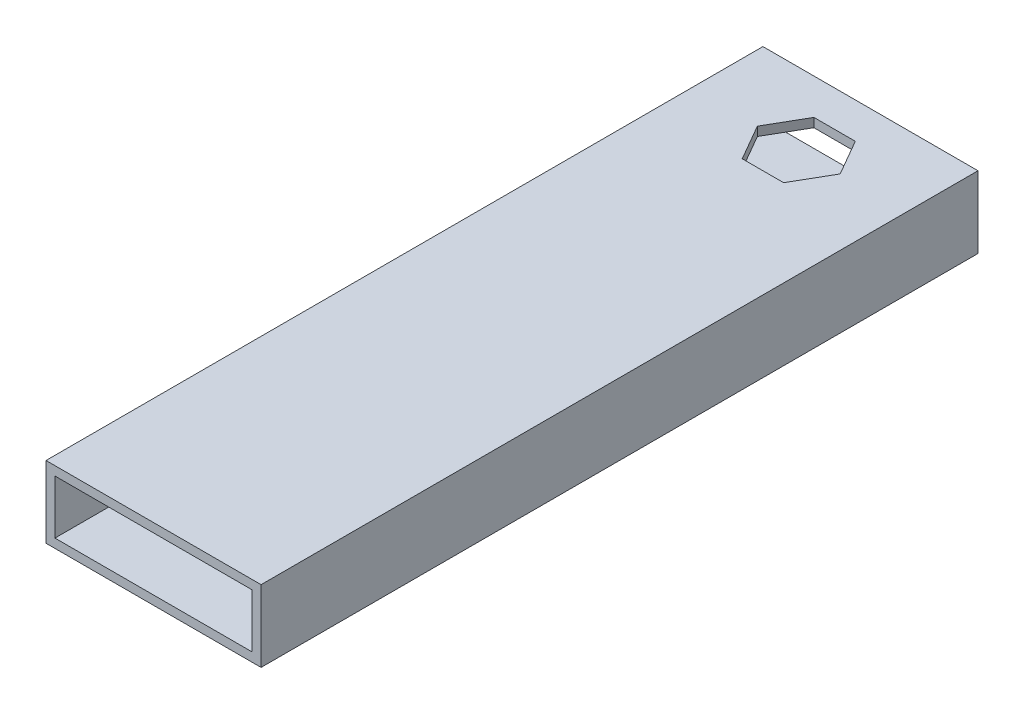
ISO-10303-21;
HEADER;
FILE_DESCRIPTION(('STEP AP214'),'2;1');
FILE_NAME('part.step','',(''),(''),'','','');
FILE_SCHEMA(('AUTOMOTIVE_DESIGN { 1 0 10303 214 1 1 1 1 }'));
ENDSEC;
DATA;
#1=APPLICATION_CONTEXT('core data for automotive mechanical design processes');
#2=APPLICATION_PROTOCOL_DEFINITION('international standard','automotive_design',2000,#1);
#3=PRODUCT_CONTEXT('',#1,'mechanical');
#4=PRODUCT('Part','Part','',(#3));
#5=PRODUCT_RELATED_PRODUCT_CATEGORY('part','',(#4));
#6=PRODUCT_DEFINITION_FORMATION('','',#4);
#7=PRODUCT_DEFINITION_CONTEXT('part definition',#1,'design');
#8=PRODUCT_DEFINITION('design','',#6,#7);
#9=PRODUCT_DEFINITION_SHAPE('','',#8);
#10=(LENGTH_UNIT() NAMED_UNIT(*) SI_UNIT(.MILLI.,.METRE.));
#11=(NAMED_UNIT(*) PLANE_ANGLE_UNIT() SI_UNIT($,.RADIAN.));
#12=(NAMED_UNIT(*) SI_UNIT($,.STERADIAN.) SOLID_ANGLE_UNIT());
#13=UNCERTAINTY_MEASURE_WITH_UNIT(LENGTH_MEASURE(1.E-05),#10,'distance_accuracy_value','');
#14=(GEOMETRIC_REPRESENTATION_CONTEXT(3) GLOBAL_UNCERTAINTY_ASSIGNED_CONTEXT((#13)) GLOBAL_UNIT_ASSIGNED_CONTEXT((#10,
#11,#12)) REPRESENTATION_CONTEXT('',''));
#15=CARTESIAN_POINT('',(0.,0.,0.));
#16=DIRECTION('',(0.,0.,1.));
#17=DIRECTION('',(1.,0.,0.));
#18=AXIS2_PLACEMENT_3D('',#15,#16,#17);
#19=CARTESIAN_POINT('',(0.,0.,127.));
#20=DIRECTION('',(1.,0.,0.));
#21=DIRECTION('',(0.,0.,-1.));
#22=AXIS2_PLACEMENT_3D('',#19,#20,#21);
#23=PLANE('',#22);
#24=DIRECTION('',(0.,-1.,0.));
#25=VECTOR('',#24,1.);
#26=CARTESIAN_POINT('',(0.,0.,0.));
#27=LINE('',#26,#25);
#28=CARTESIAN_POINT('',(0.,12.7,0.));
#29=VERTEX_POINT('',#28);
#30=CARTESIAN_POINT('',(0.,0.,0.));
#31=VERTEX_POINT('',#30);
#32=EDGE_CURVE('E278',#29,#31,#27,.T.);
#33=ORIENTED_EDGE('',*,*,#32,.T.);
#34=DIRECTION('',(0.,0.,-1.));
#35=VECTOR('',#34,1.);
#36=CARTESIAN_POINT('',(0.,0.,127.));
#37=LINE('',#36,#35);
#38=CARTESIAN_POINT('',(0.,0.,127.));
#39=VERTEX_POINT('',#38);
#40=EDGE_CURVE('E311',#39,#31,#37,.T.);
#41=ORIENTED_EDGE('',*,*,#40,.F.);
#42=DIRECTION('',(0.,-1.,0.));
#43=VECTOR('',#42,1.);
#44=CARTESIAN_POINT('',(0.,0.,127.));
#45=LINE('',#44,#43);
#46=CARTESIAN_POINT('',(0.,12.7,127.));
#47=VERTEX_POINT('',#46);
#48=EDGE_CURVE('E285',#47,#39,#45,.T.);
#49=ORIENTED_EDGE('',*,*,#48,.F.);
#50=DIRECTION('',(0.,0.,-1.));
#51=VECTOR('',#50,1.);
#52=CARTESIAN_POINT('',(0.,12.7,127.));
#53=LINE('',#52,#51);
#54=EDGE_CURVE('E295',#47,#29,#53,.T.);
#55=ORIENTED_EDGE('',*,*,#54,.T.);
#56=EDGE_LOOP('',(#33,#41,#49,#55));
#57=FACE_BOUND('',#56,.T.);
#58=ADVANCED_FACE('F33',(#57),#23,.F.);
#59=CARTESIAN_POINT('',(0.,0.,127.));
#60=DIRECTION('',(0.,1.,0.));
#61=DIRECTION('',(0.,0.,1.));
#62=AXIS2_PLACEMENT_3D('',#59,#60,#61);
#63=PLANE('',#62);
#64=DIRECTION('',(-0.5,0.,0.866025403784439));
#65=VECTOR('',#64,1.);
#66=CARTESIAN_POINT('',(26.3823484187083,0.,12.7));
#67=LINE('',#66,#65);
#68=CARTESIAN_POINT('',(26.3823484187083,0.,12.7));
#69=VERTEX_POINT('',#68);
#70=CARTESIAN_POINT('',(22.7161742093541,0.,19.05));
#71=VERTEX_POINT('',#70);
#72=EDGE_CURVE('E210',#69,#71,#67,.T.);
#73=ORIENTED_EDGE('',*,*,#72,.F.);
#74=DIRECTION('',(0.5,0.,0.866025403784439));
#75=VECTOR('',#74,1.);
#76=CARTESIAN_POINT('',(22.7161742093541,0.,6.34999999999999));
#77=LINE('',#76,#75);
#78=CARTESIAN_POINT('',(22.7161742093541,0.,6.34999999999999));
#79=VERTEX_POINT('',#78);
#80=EDGE_CURVE('E47',#79,#69,#77,.T.);
#81=ORIENTED_EDGE('',*,*,#80,.F.);
#82=DIRECTION('',(1.,0.,0.));
#83=VECTOR('',#82,1.);
#84=CARTESIAN_POINT('',(15.3838257906459,0.,6.34999999999999));
#85=LINE('',#84,#83);
#86=CARTESIAN_POINT('',(15.3838257906459,0.,6.34999999999999));
#87=VERTEX_POINT('',#86);
#88=EDGE_CURVE('E196',#87,#79,#85,.T.);
#89=ORIENTED_EDGE('',*,*,#88,.F.);
#90=DIRECTION('',(0.500000000000001,0.,-0.866025403784438));
#91=VECTOR('',#90,1.);
#92=CARTESIAN_POINT('',(11.7176515812918,0.,12.7));
#93=LINE('',#92,#91);
#94=CARTESIAN_POINT('',(11.7176515812918,0.,12.7));
#95=VERTEX_POINT('',#94);
#96=EDGE_CURVE('E199',#95,#87,#93,.T.);
#97=ORIENTED_EDGE('',*,*,#96,.F.);
#98=DIRECTION('',(-0.499999999999999,0.,-0.866025403784439));
#99=VECTOR('',#98,1.);
#100=CARTESIAN_POINT('',(15.3838257906459,0.,19.05));
#101=LINE('',#100,#99);
#102=CARTESIAN_POINT('',(15.3838257906459,0.,19.05));
#103=VERTEX_POINT('',#102);
#104=EDGE_CURVE('E216',#103,#95,#101,.T.);
#105=ORIENTED_EDGE('',*,*,#104,.F.);
#106=DIRECTION('',(-1.,0.,0.));
#107=VECTOR('',#106,1.);
#108=CARTESIAN_POINT('',(22.7161742093541,0.,19.05));
#109=LINE('',#108,#107);
#110=EDGE_CURVE('E213',#71,#103,#109,.T.);
#111=ORIENTED_EDGE('',*,*,#110,.F.);
#112=EDGE_LOOP('',(#73,#81,#89,#97,#105,#111));
#113=FACE_BOUND('',#112,.T.);
#114=DIRECTION('',(1.,0.,0.));
#115=VECTOR('',#114,1.);
#116=CARTESIAN_POINT('',(0.,0.,0.));
#117=LINE('',#116,#115);
#118=CARTESIAN_POINT('',(38.1,0.,0.));
#119=VERTEX_POINT('',#118);
#120=EDGE_CURVE('E298',#31,#119,#117,.T.);
#121=ORIENTED_EDGE('',*,*,#120,.T.);
#122=DIRECTION('',(0.,0.,-1.));
#123=VECTOR('',#122,1.);
#124=CARTESIAN_POINT('',(38.1,0.,127.));
#125=LINE('',#124,#123);
#126=CARTESIAN_POINT('',(38.1,0.,127.));
#127=VERTEX_POINT('',#126);
#128=EDGE_CURVE('E308',#127,#119,#125,.T.);
#129=ORIENTED_EDGE('',*,*,#128,.F.);
#130=DIRECTION('',(1.,0.,0.));
#131=VECTOR('',#130,1.);
#132=CARTESIAN_POINT('',(0.,0.,127.));
#133=LINE('',#132,#131);
#134=EDGE_CURVE('E288',#39,#127,#133,.T.);
#135=ORIENTED_EDGE('',*,*,#134,.F.);
#136=ORIENTED_EDGE('',*,*,#40,.T.);
#137=EDGE_LOOP('',(#121,#129,#135,#136));
#138=FACE_BOUND('',#137,.T.);
#139=ADVANCED_FACE('F341',(#113,#138),#63,.F.);
#140=CARTESIAN_POINT('',(38.1,0.,127.));
#141=DIRECTION('',(-1.,0.,0.));
#142=DIRECTION('',(0.,0.,1.));
#143=AXIS2_PLACEMENT_3D('',#140,#141,#142);
#144=PLANE('',#143);
#145=DIRECTION('',(0.,1.,0.));
#146=VECTOR('',#145,1.);
#147=CARTESIAN_POINT('',(38.1,0.,0.));
#148=LINE('',#147,#146);
#149=CARTESIAN_POINT('',(38.1,12.7,0.));
#150=VERTEX_POINT('',#149);
#151=EDGE_CURVE('E300',#119,#150,#148,.T.);
#152=ORIENTED_EDGE('',*,*,#151,.T.);
#153=DIRECTION('',(0.,0.,-1.));
#154=VECTOR('',#153,1.);
#155=CARTESIAN_POINT('',(38.1,12.7,127.));
#156=LINE('',#155,#154);
#157=CARTESIAN_POINT('',(38.1,12.7,127.));
#158=VERTEX_POINT('',#157);
#159=EDGE_CURVE('E305',#158,#150,#156,.T.);
#160=ORIENTED_EDGE('',*,*,#159,.F.);
#161=DIRECTION('',(0.,1.,0.));
#162=VECTOR('',#161,1.);
#163=CARTESIAN_POINT('',(38.1,0.,127.));
#164=LINE('',#163,#162);
#165=EDGE_CURVE('E291',#127,#158,#164,.T.);
#166=ORIENTED_EDGE('',*,*,#165,.F.);
#167=ORIENTED_EDGE('',*,*,#128,.T.);
#168=EDGE_LOOP('',(#152,#160,#166,#167));
#169=FACE_BOUND('',#168,.T.);
#170=ADVANCED_FACE('F363',(#169),#144,.F.);
#171=CARTESIAN_POINT('',(0.,12.7,127.));
#172=DIRECTION('',(0.,-1.,0.));
#173=DIRECTION('',(0.,0.,-1.));
#174=AXIS2_PLACEMENT_3D('',#171,#172,#173);
#175=PLANE('',#174);
#176=DIRECTION('',(1.,0.,0.));
#177=VECTOR('',#176,1.);
#178=CARTESIAN_POINT('',(15.3838257906459,12.7,6.34999999999999));
#179=LINE('',#178,#177);
#180=CARTESIAN_POINT('',(15.3838257906459,12.7,6.34999999999999));
#181=VERTEX_POINT('',#180);
#182=CARTESIAN_POINT('',(22.7161742093541,12.7,6.34999999999999));
#183=VERTEX_POINT('',#182);
#184=EDGE_CURVE('E195',#181,#183,#179,.T.);
#185=ORIENTED_EDGE('',*,*,#184,.T.);
#186=DIRECTION('',(0.5,0.,0.866025403784439));
#187=VECTOR('',#186,1.);
#188=CARTESIAN_POINT('',(22.7161742093541,12.7,6.34999999999999));
#189=LINE('',#188,#187);
#190=CARTESIAN_POINT('',(26.3823484187083,12.7,12.7));
#191=VERTEX_POINT('',#190);
#192=EDGE_CURVE('E176',#183,#191,#189,.T.);
#193=ORIENTED_EDGE('',*,*,#192,.T.);
#194=DIRECTION('',(-0.5,0.,0.866025403784439));
#195=VECTOR('',#194,1.);
#196=CARTESIAN_POINT('',(26.3823484187083,12.7,12.7));
#197=LINE('',#196,#195);
#198=CARTESIAN_POINT('',(22.7161742093541,12.7,19.05));
#199=VERTEX_POINT('',#198);
#200=EDGE_CURVE('E186',#191,#199,#197,.T.);
#201=ORIENTED_EDGE('',*,*,#200,.T.);
#202=DIRECTION('',(-1.,0.,0.));
#203=VECTOR('',#202,1.);
#204=CARTESIAN_POINT('',(22.7161742093541,12.7,19.05));
#205=LINE('',#204,#203);
#206=CARTESIAN_POINT('',(15.3838257906459,12.7,19.05));
#207=VERTEX_POINT('',#206);
#208=EDGE_CURVE('E55',#199,#207,#205,.T.);
#209=ORIENTED_EDGE('',*,*,#208,.T.);
#210=DIRECTION('',(-0.499999999999999,0.,-0.866025403784439));
#211=VECTOR('',#210,1.);
#212=CARTESIAN_POINT('',(15.3838257906459,12.7,19.05));
#213=LINE('',#212,#211);
#214=CARTESIAN_POINT('',(11.7176515812918,12.7,12.7));
#215=VERTEX_POINT('',#214);
#216=EDGE_CURVE('E203',#207,#215,#213,.T.);
#217=ORIENTED_EDGE('',*,*,#216,.T.);
#218=DIRECTION('',(0.500000000000001,0.,-0.866025403784438));
#219=VECTOR('',#218,1.);
#220=CARTESIAN_POINT('',(11.7176515812918,12.7,12.7));
#221=LINE('',#220,#219);
#222=EDGE_CURVE('E206',#215,#181,#221,.T.);
#223=ORIENTED_EDGE('',*,*,#222,.T.);
#224=EDGE_LOOP('',(#185,#193,#201,#209,#217,#223));
#225=FACE_BOUND('',#224,.T.);
#226=DIRECTION('',(-1.,0.,0.));
#227=VECTOR('',#226,1.);
#228=CARTESIAN_POINT('',(0.,12.7,0.));
#229=LINE('',#228,#227);
#230=EDGE_CURVE('E289',#150,#29,#229,.T.);
#231=ORIENTED_EDGE('',*,*,#230,.T.);
#232=ORIENTED_EDGE('',*,*,#54,.F.);
#233=DIRECTION('',(-1.,0.,0.));
#234=VECTOR('',#233,1.);
#235=CARTESIAN_POINT('',(0.,12.7,127.));
#236=LINE('',#235,#234);
#237=EDGE_CURVE('E293',#158,#47,#236,.T.);
#238=ORIENTED_EDGE('',*,*,#237,.F.);
#239=ORIENTED_EDGE('',*,*,#159,.T.);
#240=EDGE_LOOP('',(#231,#232,#238,#239));
#241=FACE_BOUND('',#240,.T.);
#242=ADVANCED_FACE('F191',(#225,#241),#175,.F.);
#243=CARTESIAN_POINT('',(0.,0.,127.));
#244=DIRECTION('',(0.,0.,-1.));
#245=DIRECTION('',(-1.,0.,0.));
#246=AXIS2_PLACEMENT_3D('',#243,#244,#245);
#247=PLANE('',#246);
#248=DIRECTION('',(0.,-1.,0.));
#249=VECTOR('',#248,1.);
#250=CARTESIAN_POINT('',(1.5875,11.1125,127.));
#251=LINE('',#250,#249);
#252=CARTESIAN_POINT('',(1.5875,11.1125,127.));
#253=VERTEX_POINT('',#252);
#254=CARTESIAN_POINT('',(1.5875,1.5875,127.));
#255=VERTEX_POINT('',#254);
#256=EDGE_CURVE('E268',#253,#255,#251,.T.);
#257=ORIENTED_EDGE('',*,*,#256,.F.);
#258=DIRECTION('',(-1.,0.,0.));
#259=VECTOR('',#258,1.);
#260=CARTESIAN_POINT('',(36.5125,11.1125,127.));
#261=LINE('',#260,#259);
#262=CARTESIAN_POINT('',(36.5125,11.1125,127.));
#263=VERTEX_POINT('',#262);
#264=EDGE_CURVE('E252',#263,#253,#261,.T.);
#265=ORIENTED_EDGE('',*,*,#264,.F.);
#266=DIRECTION('',(0.,1.,0.));
#267=VECTOR('',#266,1.);
#268=CARTESIAN_POINT('',(36.5125,1.5875,127.));
#269=LINE('',#268,#267);
#270=CARTESIAN_POINT('',(36.5125,1.5875,127.));
#271=VERTEX_POINT('',#270);
#272=EDGE_CURVE('E257',#271,#263,#269,.T.);
#273=ORIENTED_EDGE('',*,*,#272,.F.);
#274=DIRECTION('',(1.,0.,0.));
#275=VECTOR('',#274,1.);
#276=CARTESIAN_POINT('',(1.5875,1.5875,127.));
#277=LINE('',#276,#275);
#278=EDGE_CURVE('E271',#255,#271,#277,.T.);
#279=ORIENTED_EDGE('',*,*,#278,.F.);
#280=EDGE_LOOP('',(#257,#265,#273,#279));
#281=FACE_BOUND('',#280,.T.);
#282=ORIENTED_EDGE('',*,*,#48,.T.);
#283=ORIENTED_EDGE('',*,*,#134,.T.);
#284=ORIENTED_EDGE('',*,*,#165,.T.);
#285=ORIENTED_EDGE('',*,*,#237,.T.);
#286=EDGE_LOOP('',(#282,#283,#284,#285));
#287=FACE_BOUND('',#286,.T.);
#288=ADVANCED_FACE('F375',(#281,#287),#247,.F.);
#289=CARTESIAN_POINT('',(0.,0.,0.));
#290=DIRECTION('',(0.,0.,-1.));
#291=DIRECTION('',(-1.,0.,0.));
#292=AXIS2_PLACEMENT_3D('',#289,#290,#291);
#293=PLANE('',#292);
#294=DIRECTION('',(-1.,0.,0.));
#295=VECTOR('',#294,1.);
#296=CARTESIAN_POINT('',(36.5125,11.1125,0.));
#297=LINE('',#296,#295);
#298=CARTESIAN_POINT('',(36.5125,11.1125,0.));
#299=VERTEX_POINT('',#298);
#300=CARTESIAN_POINT('',(1.5875,11.1125,0.));
#301=VERTEX_POINT('',#300);
#302=EDGE_CURVE('E253',#299,#301,#297,.T.);
#303=ORIENTED_EDGE('',*,*,#302,.T.);
#304=DIRECTION('',(0.,-1.,0.));
#305=VECTOR('',#304,1.);
#306=CARTESIAN_POINT('',(1.5875,11.1125,0.));
#307=LINE('',#306,#305);
#308=CARTESIAN_POINT('',(1.5875,1.5875,0.));
#309=VERTEX_POINT('',#308);
#310=EDGE_CURVE('E256',#301,#309,#307,.T.);
#311=ORIENTED_EDGE('',*,*,#310,.T.);
#312=DIRECTION('',(1.,0.,0.));
#313=VECTOR('',#312,1.);
#314=CARTESIAN_POINT('',(1.5875,1.5875,0.));
#315=LINE('',#314,#313);
#316=CARTESIAN_POINT('',(36.5125,1.5875,0.));
#317=VERTEX_POINT('',#316);
#318=EDGE_CURVE('E260',#309,#317,#315,.T.);
#319=ORIENTED_EDGE('',*,*,#318,.T.);
#320=DIRECTION('',(0.,1.,0.));
#321=VECTOR('',#320,1.);
#322=CARTESIAN_POINT('',(36.5125,1.5875,0.));
#323=LINE('',#322,#321);
#324=EDGE_CURVE('E263',#317,#299,#323,.T.);
#325=ORIENTED_EDGE('',*,*,#324,.T.);
#326=EDGE_LOOP('',(#303,#311,#319,#325));
#327=FACE_BOUND('',#326,.T.);
#328=ORIENTED_EDGE('',*,*,#32,.F.);
#329=ORIENTED_EDGE('',*,*,#230,.F.);
#330=ORIENTED_EDGE('',*,*,#151,.F.);
#331=ORIENTED_EDGE('',*,*,#120,.F.);
#332=EDGE_LOOP('',(#328,#329,#330,#331));
#333=FACE_BOUND('',#332,.T.);
#334=ADVANCED_FACE('F370',(#327,#333),#293,.T.);
#335=CARTESIAN_POINT('',(36.5125,11.1125,0.));
#336=DIRECTION('',(0.,1.,0.));
#337=DIRECTION('',(0.,0.,1.));
#338=AXIS2_PLACEMENT_3D('',#335,#336,#337);
#339=PLANE('',#338);
#340=DIRECTION('',(0.5,0.,-0.866025403784439));
#341=VECTOR('',#340,1.);
#342=CARTESIAN_POINT('',(34.4141476280624,11.1125,-1.21148430679288));
#343=LINE('',#342,#341);
#344=CARTESIAN_POINT('',(22.7161742093541,11.1125,19.05));
#345=VERTEX_POINT('',#344);
#346=CARTESIAN_POINT('',(26.3823484187082,11.1125,12.7));
#347=VERTEX_POINT('',#346);
#348=EDGE_CURVE('E223',#345,#347,#343,.T.);
#349=ORIENTED_EDGE('',*,*,#348,.T.);
#350=DIRECTION('',(-0.5,0.,-0.866025403784439));
#351=VECTOR('',#350,1.);
#352=CARTESIAN_POINT('',(23.415625,11.1125,7.56148430679287));
#353=LINE('',#352,#351);
#354=CARTESIAN_POINT('',(22.7161742093541,11.1125,6.34999999999999));
#355=VERTEX_POINT('',#354);
#356=EDGE_CURVE('E179',#347,#355,#353,.T.);
#357=ORIENTED_EDGE('',*,*,#356,.T.);
#358=DIRECTION('',(-1.,0.,0.));
#359=VECTOR('',#358,1.);
#360=CARTESIAN_POINT('',(36.5125,11.1125,6.34999999999999));
#361=LINE('',#360,#359);
#362=CARTESIAN_POINT('',(15.3838257906459,11.1125,6.34999999999999));
#363=VERTEX_POINT('',#362);
#364=EDGE_CURVE('E248',#355,#363,#361,.T.);
#365=ORIENTED_EDGE('',*,*,#364,.T.);
#366=DIRECTION('',(-0.500000000000001,0.,0.866025403784438));
#367=VECTOR('',#366,1.);
#368=CARTESIAN_POINT('',(23.415625,11.1125,-7.56148430679288));
#369=LINE('',#368,#367);
#370=CARTESIAN_POINT('',(11.7176515812918,11.1125,12.7));
#371=VERTEX_POINT('',#370);
#372=EDGE_CURVE('E245',#363,#371,#369,.T.);
#373=ORIENTED_EDGE('',*,*,#372,.T.);
#374=DIRECTION('',(0.499999999999999,0.,0.866025403784439));
#375=VECTOR('',#374,1.);
#376=CARTESIAN_POINT('',(12.4171023719376,11.1125,13.9114843067929));
#377=LINE('',#376,#375);
#378=CARTESIAN_POINT('',(15.3838257906459,11.1125,19.05));
#379=VERTEX_POINT('',#378);
#380=EDGE_CURVE('E242',#371,#379,#377,.T.);
#381=ORIENTED_EDGE('',*,*,#380,.T.);
#382=DIRECTION('',(1.,0.,0.));
#383=VECTOR('',#382,1.);
#384=CARTESIAN_POINT('',(36.5125,11.1125,19.05));
#385=LINE('',#384,#383);
#386=EDGE_CURVE('E239',#379,#345,#385,.T.);
#387=ORIENTED_EDGE('',*,*,#386,.T.);
#388=EDGE_LOOP('',(#349,#357,#365,#373,#381,#387));
#389=FACE_BOUND('',#388,.T.);
#390=ORIENTED_EDGE('',*,*,#264,.T.);
#391=DIRECTION('',(0.,0.,1.));
#392=VECTOR('',#391,1.);
#393=CARTESIAN_POINT('',(1.5875,11.1125,0.));
#394=LINE('',#393,#392);
#395=EDGE_CURVE('E266',#301,#253,#394,.T.);
#396=ORIENTED_EDGE('',*,*,#395,.F.);
#397=ORIENTED_EDGE('',*,*,#302,.F.);
#398=DIRECTION('',(0.,0.,1.));
#399=VECTOR('',#398,1.);
#400=CARTESIAN_POINT('',(36.5125,11.1125,0.));
#401=LINE('',#400,#399);
#402=EDGE_CURVE('E276',#299,#263,#401,.T.);
#403=ORIENTED_EDGE('',*,*,#402,.T.);
#404=EDGE_LOOP('',(#390,#396,#397,#403));
#405=FACE_BOUND('',#404,.T.);
#406=ADVANCED_FACE('F388',(#389,#405),#339,.F.);
#407=CARTESIAN_POINT('',(36.5125,1.5875,0.));
#408=DIRECTION('',(1.,0.,0.));
#409=DIRECTION('',(0.,0.,-1.));
#410=AXIS2_PLACEMENT_3D('',#407,#408,#409);
#411=PLANE('',#410);
#412=ORIENTED_EDGE('',*,*,#272,.T.);
#413=ORIENTED_EDGE('',*,*,#402,.F.);
#414=ORIENTED_EDGE('',*,*,#324,.F.);
#415=DIRECTION('',(0.,0.,1.));
#416=VECTOR('',#415,1.);
#417=CARTESIAN_POINT('',(36.5125,1.5875,0.));
#418=LINE('',#417,#416);
#419=EDGE_CURVE('E279',#317,#271,#418,.T.);
#420=ORIENTED_EDGE('',*,*,#419,.T.);
#421=EDGE_LOOP('',(#412,#413,#414,#420));
#422=FACE_BOUND('',#421,.T.);
#423=ADVANCED_FACE('F395',(#422),#411,.F.);
#424=CARTESIAN_POINT('',(1.5875,1.5875,0.));
#425=DIRECTION('',(0.,-1.,0.));
#426=DIRECTION('',(0.,0.,-1.));
#427=AXIS2_PLACEMENT_3D('',#424,#425,#426);
#428=PLANE('',#427);
#429=DIRECTION('',(1.,0.,0.));
#430=VECTOR('',#429,1.);
#431=CARTESIAN_POINT('',(1.5875,1.5875,6.34999999999999));
#432=LINE('',#431,#430);
#433=CARTESIAN_POINT('',(15.3838257906459,1.5875,6.34999999999999));
#434=VERTEX_POINT('',#433);
#435=CARTESIAN_POINT('',(22.7161742093541,1.5875,6.34999999999999));
#436=VERTEX_POINT('',#435);
#437=EDGE_CURVE('E40',#434,#436,#432,.T.);
#438=ORIENTED_EDGE('',*,*,#437,.T.);
#439=DIRECTION('',(0.5,0.,0.866025403784439));
#440=VECTOR('',#439,1.);
#441=CARTESIAN_POINT('',(14.684375,1.5875,-7.56148430679288));
#442=LINE('',#441,#440);
#443=CARTESIAN_POINT('',(26.3823484187083,1.5875,12.7));
#444=VERTEX_POINT('',#443);
#445=EDGE_CURVE('E11',#436,#444,#442,.T.);
#446=ORIENTED_EDGE('',*,*,#445,.T.);
#447=DIRECTION('',(-0.5,0.,0.866025403784439));
#448=VECTOR('',#447,1.);
#449=CARTESIAN_POINT('',(25.6828976280624,1.5875,13.9114843067929));
#450=LINE('',#449,#448);
#451=CARTESIAN_POINT('',(22.7161742093541,1.5875,19.05));
#452=VERTEX_POINT('',#451);
#453=EDGE_CURVE('E314',#444,#452,#450,.T.);
#454=ORIENTED_EDGE('',*,*,#453,.T.);
#455=DIRECTION('',(-1.,0.,0.));
#456=VECTOR('',#455,1.);
#457=CARTESIAN_POINT('',(1.5875,1.5875,19.05));
#458=LINE('',#457,#456);
#459=CARTESIAN_POINT('',(15.3838257906459,1.5875,19.05));
#460=VERTEX_POINT('',#459);
#461=EDGE_CURVE('E317',#452,#460,#458,.T.);
#462=ORIENTED_EDGE('',*,*,#461,.T.);
#463=DIRECTION('',(-0.499999999999999,0.,-0.866025403784439));
#464=VECTOR('',#463,1.);
#465=CARTESIAN_POINT('',(3.68585237193765,1.5875,-1.21148430679289));
#466=LINE('',#465,#464);
#467=CARTESIAN_POINT('',(11.7176515812918,1.5875,12.7));
#468=VERTEX_POINT('',#467);
#469=EDGE_CURVE('E320',#460,#468,#466,.T.);
#470=ORIENTED_EDGE('',*,*,#469,.T.);
#471=DIRECTION('',(0.500000000000001,0.,-0.866025403784438));
#472=VECTOR('',#471,1.);
#473=CARTESIAN_POINT('',(14.684375,1.5875,7.56148430679289));
#474=LINE('',#473,#472);
#475=EDGE_CURVE('E323',#468,#434,#474,.T.);
#476=ORIENTED_EDGE('',*,*,#475,.T.);
#477=EDGE_LOOP('',(#438,#446,#454,#462,#470,#476));
#478=FACE_BOUND('',#477,.T.);
#479=ORIENTED_EDGE('',*,*,#278,.T.);
#480=ORIENTED_EDGE('',*,*,#419,.F.);
#481=ORIENTED_EDGE('',*,*,#318,.F.);
#482=DIRECTION('',(0.,0.,1.));
#483=VECTOR('',#482,1.);
#484=CARTESIAN_POINT('',(1.5875,1.5875,0.));
#485=LINE('',#484,#483);
#486=EDGE_CURVE('E281',#309,#255,#485,.T.);
#487=ORIENTED_EDGE('',*,*,#486,.T.);
#488=EDGE_LOOP('',(#479,#480,#481,#487));
#489=FACE_BOUND('',#488,.T.);
#490=ADVANCED_FACE('F327',(#478,#489),#428,.F.);
#491=CARTESIAN_POINT('',(1.5875,11.1125,0.));
#492=DIRECTION('',(-1.,0.,0.));
#493=DIRECTION('',(0.,0.,1.));
#494=AXIS2_PLACEMENT_3D('',#491,#492,#493);
#495=PLANE('',#494);
#496=ORIENTED_EDGE('',*,*,#256,.T.);
#497=ORIENTED_EDGE('',*,*,#486,.F.);
#498=ORIENTED_EDGE('',*,*,#310,.F.);
#499=ORIENTED_EDGE('',*,*,#395,.T.);
#500=EDGE_LOOP('',(#496,#497,#498,#499));
#501=FACE_BOUND('',#500,.T.);
#502=ADVANCED_FACE('F397',(#501),#495,.F.);
#503=CARTESIAN_POINT('',(26.3823484187083,12.7,12.7));
#504=DIRECTION('',(0.866025403784438,0.,0.5));
#505=DIRECTION('',(0.5,0.,-0.866025403784439));
#506=AXIS2_PLACEMENT_3D('',#503,#504,#505);
#507=PLANE('',#506);
#508=DIRECTION('',(0.,-1.,0.));
#509=VECTOR('',#508,1.);
#510=CARTESIAN_POINT('',(26.3823484187083,12.7,12.7));
#511=LINE('',#510,#509);
#512=EDGE_CURVE('E183',#444,#69,#511,.T.);
#513=ORIENTED_EDGE('',*,*,#512,.T.);
#514=ORIENTED_EDGE('',*,*,#72,.T.);
#515=DIRECTION('',(0.,-1.,0.));
#516=VECTOR('',#515,1.);
#517=CARTESIAN_POINT('',(22.7161742093541,12.7,19.05));
#518=LINE('',#517,#516);
#519=EDGE_CURVE('E182',#452,#71,#518,.T.);
#520=ORIENTED_EDGE('',*,*,#519,.F.);
#521=ORIENTED_EDGE('',*,*,#453,.F.);
#522=EDGE_LOOP('',(#513,#514,#520,#521));
#523=FACE_BOUND('',#522,.T.);
#524=ADVANCED_FACE('F345',(#523),#507,.F.);
#525=CARTESIAN_POINT('',(22.7161742093541,12.7,19.05));
#526=DIRECTION('',(0.,0.,1.));
#527=DIRECTION('',(1.,0.,0.));
#528=AXIS2_PLACEMENT_3D('',#525,#526,#527);
#529=PLANE('',#528);
#530=ORIENTED_EDGE('',*,*,#519,.T.);
#531=ORIENTED_EDGE('',*,*,#110,.T.);
#532=DIRECTION('',(0.,-1.,0.));
#533=VECTOR('',#532,1.);
#534=CARTESIAN_POINT('',(15.3838257906459,12.7,19.05));
#535=LINE('',#534,#533);
#536=EDGE_CURVE('E236',#460,#103,#535,.T.);
#537=ORIENTED_EDGE('',*,*,#536,.F.);
#538=ORIENTED_EDGE('',*,*,#461,.F.);
#539=EDGE_LOOP('',(#530,#531,#537,#538));
#540=FACE_BOUND('',#539,.T.);
#541=ADVANCED_FACE('F433',(#540),#529,.F.);
#542=CARTESIAN_POINT('',(15.3838257906459,12.7,19.05));
#543=DIRECTION('',(-0.866025403784439,0.,0.499999999999999));
#544=DIRECTION('',(0.499999999999999,0.,0.866025403784439));
#545=AXIS2_PLACEMENT_3D('',#542,#543,#544);
#546=PLANE('',#545);
#547=ORIENTED_EDGE('',*,*,#536,.T.);
#548=ORIENTED_EDGE('',*,*,#104,.T.);
#549=DIRECTION('',(0.,-1.,0.));
#550=VECTOR('',#549,1.);
#551=CARTESIAN_POINT('',(11.7176515812918,12.7,12.7));
#552=LINE('',#551,#550);
#553=EDGE_CURVE('E232',#468,#95,#552,.T.);
#554=ORIENTED_EDGE('',*,*,#553,.F.);
#555=ORIENTED_EDGE('',*,*,#469,.F.);
#556=EDGE_LOOP('',(#547,#548,#554,#555));
#557=FACE_BOUND('',#556,.T.);
#558=ADVANCED_FACE('F439',(#557),#546,.F.);
#559=CARTESIAN_POINT('',(11.7176515812918,12.7,12.7));
#560=DIRECTION('',(-0.866025403784438,0.,-0.500000000000001));
#561=DIRECTION('',(-0.500000000000001,0.,0.866025403784438));
#562=AXIS2_PLACEMENT_3D('',#559,#560,#561);
#563=PLANE('',#562);
#564=ORIENTED_EDGE('',*,*,#553,.T.);
#565=ORIENTED_EDGE('',*,*,#96,.T.);
#566=DIRECTION('',(0.,-1.,0.));
#567=VECTOR('',#566,1.);
#568=CARTESIAN_POINT('',(15.3838257906459,12.7,6.34999999999999));
#569=LINE('',#568,#567);
#570=EDGE_CURVE('E228',#434,#87,#569,.T.);
#571=ORIENTED_EDGE('',*,*,#570,.F.);
#572=ORIENTED_EDGE('',*,*,#475,.F.);
#573=EDGE_LOOP('',(#564,#565,#571,#572));
#574=FACE_BOUND('',#573,.T.);
#575=ADVANCED_FACE('F334',(#574),#563,.F.);
#576=CARTESIAN_POINT('',(15.3838257906459,12.7,6.34999999999999));
#577=DIRECTION('',(0.,0.,-1.));
#578=DIRECTION('',(-1.,0.,0.));
#579=AXIS2_PLACEMENT_3D('',#576,#577,#578);
#580=PLANE('',#579);
#581=ORIENTED_EDGE('',*,*,#570,.T.);
#582=ORIENTED_EDGE('',*,*,#88,.T.);
#583=DIRECTION('',(0.,-1.,0.));
#584=VECTOR('',#583,1.);
#585=CARTESIAN_POINT('',(22.7161742093541,12.7,6.34999999999999));
#586=LINE('',#585,#584);
#587=EDGE_CURVE('E224',#436,#79,#586,.T.);
#588=ORIENTED_EDGE('',*,*,#587,.F.);
#589=ORIENTED_EDGE('',*,*,#437,.F.);
#590=EDGE_LOOP('',(#581,#582,#588,#589));
#591=FACE_BOUND('',#590,.T.);
#592=ADVANCED_FACE('F332',(#591),#580,.F.);
#593=CARTESIAN_POINT('',(22.7161742093541,12.7,6.34999999999999));
#594=DIRECTION('',(0.866025403784439,0.,-0.5));
#595=DIRECTION('',(-0.5,0.,-0.866025403784439));
#596=AXIS2_PLACEMENT_3D('',#593,#594,#595);
#597=PLANE('',#596);
#598=ORIENTED_EDGE('',*,*,#587,.T.);
#599=ORIENTED_EDGE('',*,*,#80,.T.);
#600=ORIENTED_EDGE('',*,*,#512,.F.);
#601=ORIENTED_EDGE('',*,*,#445,.F.);
#602=EDGE_LOOP('',(#598,#599,#600,#601));
#603=FACE_BOUND('',#602,.T.);
#604=ADVANCED_FACE('F347',(#603),#597,.F.);
#605=EDGE_CURVE('E171',#191,#347,#511,.T.);
#606=ORIENTED_EDGE('',*,*,#605,.F.);
#607=ORIENTED_EDGE('',*,*,#192,.F.);
#608=EDGE_CURVE('E221',#183,#355,#586,.T.);
#609=ORIENTED_EDGE('',*,*,#608,.T.);
#610=ORIENTED_EDGE('',*,*,#356,.F.);
#611=EDGE_LOOP('',(#606,#607,#609,#610));
#612=FACE_BOUND('',#611,.T.);
#613=ADVANCED_FACE('F173',(#612),#597,.F.);
#614=ORIENTED_EDGE('',*,*,#608,.F.);
#615=ORIENTED_EDGE('',*,*,#184,.F.);
#616=EDGE_CURVE('E225',#181,#363,#569,.T.);
#617=ORIENTED_EDGE('',*,*,#616,.T.);
#618=ORIENTED_EDGE('',*,*,#364,.F.);
#619=EDGE_LOOP('',(#614,#615,#617,#618));
#620=FACE_BOUND('',#619,.T.);
#621=ADVANCED_FACE('F354',(#620),#580,.F.);
#622=ORIENTED_EDGE('',*,*,#616,.F.);
#623=ORIENTED_EDGE('',*,*,#222,.F.);
#624=EDGE_CURVE('E229',#215,#371,#552,.T.);
#625=ORIENTED_EDGE('',*,*,#624,.T.);
#626=ORIENTED_EDGE('',*,*,#372,.F.);
#627=EDGE_LOOP('',(#622,#623,#625,#626));
#628=FACE_BOUND('',#627,.T.);
#629=ADVANCED_FACE('F456',(#628),#563,.F.);
#630=ORIENTED_EDGE('',*,*,#624,.F.);
#631=ORIENTED_EDGE('',*,*,#216,.F.);
#632=EDGE_CURVE('E233',#207,#379,#535,.T.);
#633=ORIENTED_EDGE('',*,*,#632,.T.);
#634=ORIENTED_EDGE('',*,*,#380,.F.);
#635=EDGE_LOOP('',(#630,#631,#633,#634));
#636=FACE_BOUND('',#635,.T.);
#637=ADVANCED_FACE('F450',(#636),#546,.F.);
#638=ORIENTED_EDGE('',*,*,#632,.F.);
#639=ORIENTED_EDGE('',*,*,#208,.F.);
#640=EDGE_CURVE('E188',#199,#345,#518,.T.);
#641=ORIENTED_EDGE('',*,*,#640,.T.);
#642=ORIENTED_EDGE('',*,*,#386,.F.);
#643=EDGE_LOOP('',(#638,#639,#641,#642));
#644=FACE_BOUND('',#643,.T.);
#645=ADVANCED_FACE('F442',(#644),#529,.F.);
#646=ORIENTED_EDGE('',*,*,#640,.F.);
#647=ORIENTED_EDGE('',*,*,#200,.F.);
#648=ORIENTED_EDGE('',*,*,#605,.T.);
#649=ORIENTED_EDGE('',*,*,#348,.F.);
#650=EDGE_LOOP('',(#646,#647,#648,#649));
#651=FACE_BOUND('',#650,.T.);
#652=ADVANCED_FACE('F187',(#651),#507,.F.);
#653=CLOSED_SHELL('',(#58,#139,#170,#242,#288,#334,#406,#423,#490,#502,#524,#541,#558,#575,#592,
#604,#613,#621,#629,#637,#645,#652));
#654=MANIFOLD_SOLID_BREP('B2',#653);
#655=ADVANCED_BREP_SHAPE_REPRESENTATION('',(#18,#654),#14);
#656=SHAPE_DEFINITION_REPRESENTATION(#9,#655);
ENDSEC;
END-ISO-10303-21;
